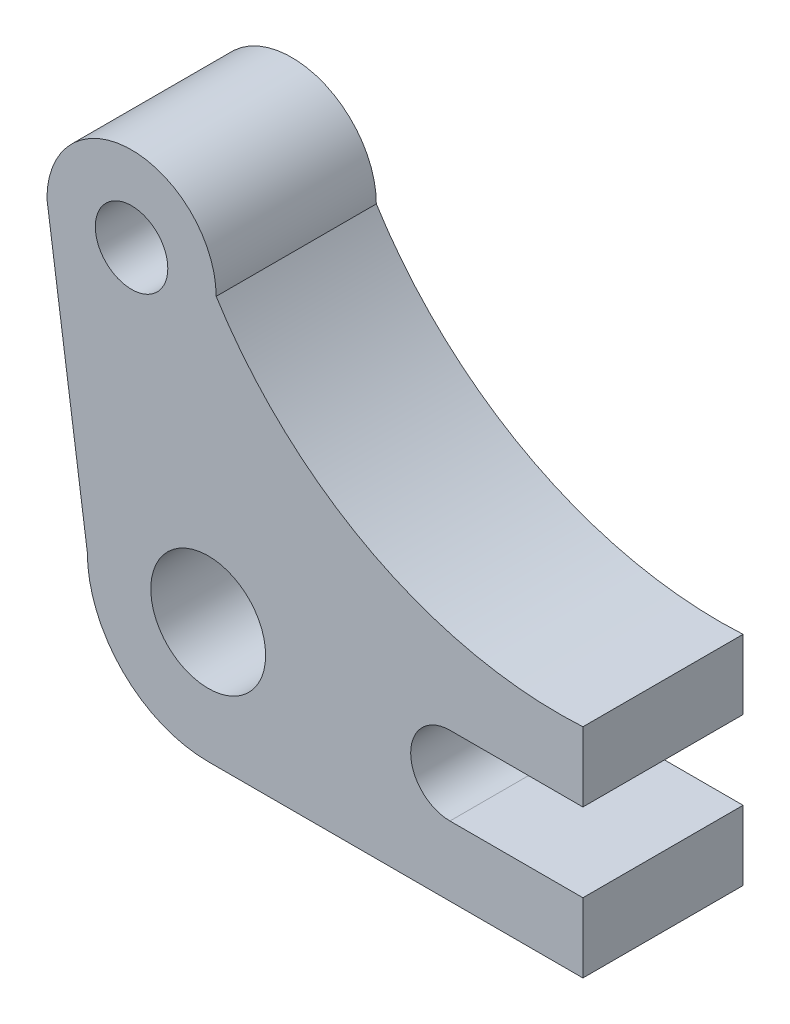
ISO-10303-21;
HEADER;
FILE_DESCRIPTION(('STEP AP214'),'2;1');
FILE_NAME('part.step','',(''),(''),'','','');
FILE_SCHEMA(('AUTOMOTIVE_DESIGN { 1 0 10303 214 1 1 1 1 }'));
ENDSEC;
DATA;
#1=APPLICATION_CONTEXT('core data for automotive mechanical design processes');
#2=APPLICATION_PROTOCOL_DEFINITION('international standard','automotive_design',2000,#1);
#3=PRODUCT_CONTEXT('',#1,'mechanical');
#4=PRODUCT('Part','Part','',(#3));
#5=PRODUCT_RELATED_PRODUCT_CATEGORY('part','',(#4));
#6=PRODUCT_DEFINITION_FORMATION('','',#4);
#7=PRODUCT_DEFINITION_CONTEXT('part definition',#1,'design');
#8=PRODUCT_DEFINITION('design','',#6,#7);
#9=PRODUCT_DEFINITION_SHAPE('','',#8);
#10=(LENGTH_UNIT() NAMED_UNIT(*) SI_UNIT(.MILLI.,.METRE.));
#11=(NAMED_UNIT(*) PLANE_ANGLE_UNIT() SI_UNIT($,.RADIAN.));
#12=(NAMED_UNIT(*) SI_UNIT($,.STERADIAN.) SOLID_ANGLE_UNIT());
#13=UNCERTAINTY_MEASURE_WITH_UNIT(LENGTH_MEASURE(1.E-05),#10,'distance_accuracy_value','');
#14=(GEOMETRIC_REPRESENTATION_CONTEXT(3) GLOBAL_UNCERTAINTY_ASSIGNED_CONTEXT((#13)) GLOBAL_UNIT_ASSIGNED_CONTEXT((#10,
#11,#12)) REPRESENTATION_CONTEXT('',''));
#15=CARTESIAN_POINT('',(0.,0.,0.));
#16=DIRECTION('',(0.,0.,1.));
#17=DIRECTION('',(1.,0.,0.));
#18=AXIS2_PLACEMENT_3D('',#15,#16,#17);
#19=CARTESIAN_POINT('',(58.1047405715076,82.8866724690707,26.5));
#20=DIRECTION('',(0.,0.,-1.));
#21=DIRECTION('',(-1.,0.,0.));
#22=AXIS2_PLACEMENT_3D('',#19,#20,#21);
#23=CYLINDRICAL_SURFACE('',#22,67.);
#24=CARTESIAN_POINT('',(58.1047405715076,82.8866724690707,0.));
#25=DIRECTION('',(0.,0.,1.));
#26=DIRECTION('',(1.,0.,0.));
#27=AXIS2_PLACEMENT_3D('',#24,#25,#26);
#28=CIRCLE('',#27,67.);
#29=CARTESIAN_POINT('',(1.31786678997644,47.3303654881644,0.));
#30=VERTEX_POINT('',#29);
#31=CARTESIAN_POINT('',(62.,16.,0.));
#32=VERTEX_POINT('',#31);
#33=EDGE_CURVE('E158',#30,#32,#28,.T.);
#34=ORIENTED_EDGE('',*,*,#33,.F.);
#35=DIRECTION('',(0.,0.,-1.));
#36=VECTOR('',#35,1.);
#37=CARTESIAN_POINT('',(1.31786678997644,47.3303654881644,26.5));
#38=LINE('',#37,#36);
#39=CARTESIAN_POINT('',(1.31786678997644,47.3303654881644,26.5));
#40=VERTEX_POINT('',#39);
#41=EDGE_CURVE('E11',#40,#30,#38,.T.);
#42=ORIENTED_EDGE('',*,*,#41,.F.);
#43=CARTESIAN_POINT('',(58.1047405715076,82.8866724690707,26.5));
#44=DIRECTION('',(0.,0.,1.));
#45=DIRECTION('',(1.,0.,0.));
#46=AXIS2_PLACEMENT_3D('',#43,#44,#45);
#47=CIRCLE('',#46,67.);
#48=CARTESIAN_POINT('',(62.,16.,26.5));
#49=VERTEX_POINT('',#48);
#50=EDGE_CURVE('E185',#40,#49,#47,.T.);
#51=ORIENTED_EDGE('',*,*,#50,.T.);
#52=DIRECTION('',(0.,0.,-1.));
#53=VECTOR('',#52,1.);
#54=CARTESIAN_POINT('',(62.,16.,26.5));
#55=LINE('',#54,#53);
#56=EDGE_CURVE('E101',#49,#32,#55,.T.);
#57=ORIENTED_EDGE('',*,*,#56,.T.);
#58=EDGE_LOOP('',(#34,#42,#51,#57));
#59=FACE_BOUND('',#58,.T.);
#60=ADVANCED_FACE('F45',(#59),#23,.F.);
#61=CARTESIAN_POINT('',(-12.6821332100236,47.3303654881643,26.5));
#62=DIRECTION('',(0.,0.,-1.));
#63=DIRECTION('',(-1.,0.,0.));
#64=AXIS2_PLACEMENT_3D('',#61,#62,#63);
#65=CYLINDRICAL_SURFACE('',#64,14.);
#66=CARTESIAN_POINT('',(-12.6821332100236,47.3303654881643,0.));
#67=DIRECTION('',(0.,0.,1.));
#68=DIRECTION('',(1.,0.,0.));
#69=AXIS2_PLACEMENT_3D('',#66,#67,#68);
#70=CIRCLE('',#69,14.);
#71=CARTESIAN_POINT('',(-26.6821332100236,47.3303654881643,0.));
#72=VERTEX_POINT('',#71);
#73=EDGE_CURVE('E161',#30,#72,#70,.T.);
#74=ORIENTED_EDGE('',*,*,#73,.T.);
#75=DIRECTION('',(0.,0.,-1.));
#76=VECTOR('',#75,1.);
#77=CARTESIAN_POINT('',(-26.6821332100236,47.3303654881643,26.5));
#78=LINE('',#77,#76);
#79=CARTESIAN_POINT('',(-26.6821332100236,47.3303654881643,26.5));
#80=VERTEX_POINT('',#79);
#81=EDGE_CURVE('E53',#80,#72,#78,.T.);
#82=ORIENTED_EDGE('',*,*,#81,.F.);
#83=CARTESIAN_POINT('',(-12.6821332100236,47.3303654881643,26.5));
#84=DIRECTION('',(0.,0.,1.));
#85=DIRECTION('',(1.,0.,0.));
#86=AXIS2_PLACEMENT_3D('',#83,#84,#85);
#87=CIRCLE('',#86,14.);
#88=EDGE_CURVE('E230',#40,#80,#87,.T.);
#89=ORIENTED_EDGE('',*,*,#88,.F.);
#90=ORIENTED_EDGE('',*,*,#41,.T.);
#91=EDGE_LOOP('',(#74,#82,#89,#90));
#92=FACE_BOUND('',#91,.T.);
#93=ADVANCED_FACE('F232',(#92),#65,.T.);
#94=CARTESIAN_POINT('',(-19.6091507108185,-2.76843324224664,26.5));
#95=DIRECTION('',(0.990180557040445,0.13979436490458,0.));
#96=DIRECTION('',(-0.13979436490458,0.990180557040445,0.));
#97=AXIS2_PLACEMENT_3D('',#94,#95,#96);
#98=PLANE('',#97);
#99=DIRECTION('',(0.13979436490458,-0.990180557040445,0.));
#100=VECTOR('',#99,1.);
#101=CARTESIAN_POINT('',(-19.6091507108185,-2.76843324224664,0.));
#102=LINE('',#101,#100);
#103=CARTESIAN_POINT('',(-20.,0.,0.));
#104=VERTEX_POINT('',#103);
#105=EDGE_CURVE('E163',#72,#104,#102,.T.);
#106=ORIENTED_EDGE('',*,*,#105,.T.);
#107=DIRECTION('',(0.,0.,-1.));
#108=VECTOR('',#107,1.);
#109=CARTESIAN_POINT('',(-20.,0.,26.5));
#110=LINE('',#109,#108);
#111=CARTESIAN_POINT('',(-20.,0.,26.5));
#112=VERTEX_POINT('',#111);
#113=EDGE_CURVE('E197',#112,#104,#110,.T.);
#114=ORIENTED_EDGE('',*,*,#113,.F.);
#115=DIRECTION('',(0.13979436490458,-0.990180557040445,0.));
#116=VECTOR('',#115,1.);
#117=CARTESIAN_POINT('',(-19.6091507108185,-2.76843324224664,26.5));
#118=LINE('',#117,#116);
#119=EDGE_CURVE('E206',#80,#112,#118,.T.);
#120=ORIENTED_EDGE('',*,*,#119,.F.);
#121=ORIENTED_EDGE('',*,*,#81,.T.);
#122=EDGE_LOOP('',(#106,#114,#120,#121));
#123=FACE_BOUND('',#122,.T.);
#124=ADVANCED_FACE('F204',(#123),#98,.F.);
#125=CARTESIAN_POINT('',(0.,0.,26.5));
#126=DIRECTION('',(0.,0.,-1.));
#127=DIRECTION('',(-1.,0.,0.));
#128=AXIS2_PLACEMENT_3D('',#125,#126,#127);
#129=CYLINDRICAL_SURFACE('',#128,20.);
#130=CARTESIAN_POINT('',(0.,0.,0.));
#131=DIRECTION('',(0.,0.,1.));
#132=DIRECTION('',(1.,0.,0.));
#133=AXIS2_PLACEMENT_3D('',#130,#131,#132);
#134=CIRCLE('',#133,20.);
#135=CARTESIAN_POINT('',(0.,-20.,0.));
#136=VERTEX_POINT('',#135);
#137=EDGE_CURVE('E165',#104,#136,#134,.T.);
#138=ORIENTED_EDGE('',*,*,#137,.T.);
#139=DIRECTION('',(0.,0.,-1.));
#140=VECTOR('',#139,1.);
#141=CARTESIAN_POINT('',(0.,-20.,26.5));
#142=LINE('',#141,#140);
#143=CARTESIAN_POINT('',(0.,-20.,26.5));
#144=VERTEX_POINT('',#143);
#145=EDGE_CURVE('E194',#144,#136,#142,.T.);
#146=ORIENTED_EDGE('',*,*,#145,.F.);
#147=CARTESIAN_POINT('',(0.,0.,26.5));
#148=DIRECTION('',(0.,0.,1.));
#149=DIRECTION('',(1.,0.,0.));
#150=AXIS2_PLACEMENT_3D('',#147,#148,#149);
#151=CIRCLE('',#150,20.);
#152=EDGE_CURVE('E225',#112,#144,#151,.T.);
#153=ORIENTED_EDGE('',*,*,#152,.F.);
#154=ORIENTED_EDGE('',*,*,#113,.T.);
#155=EDGE_LOOP('',(#138,#146,#153,#154));
#156=FACE_BOUND('',#155,.T.);
#157=ADVANCED_FACE('F217',(#156),#129,.T.);
#158=CARTESIAN_POINT('',(0.,-20.,26.5));
#159=DIRECTION('',(0.,1.,0.));
#160=DIRECTION('',(0.,0.,1.));
#161=AXIS2_PLACEMENT_3D('',#158,#159,#160);
#162=PLANE('',#161);
#163=DIRECTION('',(1.,0.,0.));
#164=VECTOR('',#163,1.);
#165=CARTESIAN_POINT('',(0.,-20.,0.));
#166=LINE('',#165,#164);
#167=CARTESIAN_POINT('',(62.,-20.,0.));
#168=VERTEX_POINT('',#167);
#169=EDGE_CURVE('E167',#136,#168,#166,.T.);
#170=ORIENTED_EDGE('',*,*,#169,.T.);
#171=DIRECTION('',(0.,0.,-1.));
#172=VECTOR('',#171,1.);
#173=CARTESIAN_POINT('',(62.,-20.,26.5));
#174=LINE('',#173,#172);
#175=CARTESIAN_POINT('',(62.,-20.,26.5));
#176=VERTEX_POINT('',#175);
#177=EDGE_CURVE('E191',#176,#168,#174,.T.);
#178=ORIENTED_EDGE('',*,*,#177,.F.);
#179=DIRECTION('',(1.,0.,0.));
#180=VECTOR('',#179,1.);
#181=CARTESIAN_POINT('',(0.,-20.,26.5));
#182=LINE('',#181,#180);
#183=EDGE_CURVE('E223',#144,#176,#182,.T.);
#184=ORIENTED_EDGE('',*,*,#183,.F.);
#185=ORIENTED_EDGE('',*,*,#145,.T.);
#186=EDGE_LOOP('',(#170,#178,#184,#185));
#187=FACE_BOUND('',#186,.T.);
#188=ADVANCED_FACE('F221',(#187),#162,.F.);
#189=CARTESIAN_POINT('',(62.,0.,26.5));
#190=DIRECTION('',(-1.,0.,0.));
#191=DIRECTION('',(0.,0.,1.));
#192=AXIS2_PLACEMENT_3D('',#189,#190,#191);
#193=PLANE('',#192);
#194=DIRECTION('',(0.,1.,0.));
#195=VECTOR('',#194,1.);
#196=CARTESIAN_POINT('',(62.,0.,0.));
#197=LINE('',#196,#195);
#198=CARTESIAN_POINT('',(62.,-8.5,0.));
#199=VERTEX_POINT('',#198);
#200=EDGE_CURVE('E169',#168,#199,#197,.T.);
#201=ORIENTED_EDGE('',*,*,#200,.T.);
#202=DIRECTION('',(0.,0.,-1.));
#203=VECTOR('',#202,1.);
#204=CARTESIAN_POINT('',(62.,-8.5,26.5));
#205=LINE('',#204,#203);
#206=CARTESIAN_POINT('',(62.,-8.5,26.5));
#207=VERTEX_POINT('',#206);
#208=EDGE_CURVE('E189',#207,#199,#205,.T.);
#209=ORIENTED_EDGE('',*,*,#208,.F.);
#210=DIRECTION('',(0.,1.,0.));
#211=VECTOR('',#210,1.);
#212=CARTESIAN_POINT('',(62.,0.,26.5));
#213=LINE('',#212,#211);
#214=EDGE_CURVE('E147',#176,#207,#213,.T.);
#215=ORIENTED_EDGE('',*,*,#214,.F.);
#216=ORIENTED_EDGE('',*,*,#177,.T.);
#217=EDGE_LOOP('',(#201,#209,#215,#216));
#218=FACE_BOUND('',#217,.T.);
#219=ADVANCED_FACE('F244',(#218),#193,.F.);
#220=CARTESIAN_POINT('',(0.,-8.5,26.5));
#221=DIRECTION('',(0.,1.,0.));
#222=DIRECTION('',(0.,0.,1.));
#223=AXIS2_PLACEMENT_3D('',#220,#221,#222);
#224=PLANE('',#223);
#225=DIRECTION('',(1.,0.,0.));
#226=VECTOR('',#225,1.);
#227=CARTESIAN_POINT('',(0.,-8.5,0.));
#228=LINE('',#227,#226);
#229=CARTESIAN_POINT('',(40.,-8.5,0.));
#230=VERTEX_POINT('',#229);
#231=EDGE_CURVE('E172',#230,#199,#228,.T.);
#232=ORIENTED_EDGE('',*,*,#231,.F.);
#233=DIRECTION('',(0.,0.,-1.));
#234=VECTOR('',#233,1.);
#235=CARTESIAN_POINT('',(40.,-8.5,26.5));
#236=LINE('',#235,#234);
#237=CARTESIAN_POINT('',(40.,-8.5,26.5));
#238=VERTEX_POINT('',#237);
#239=EDGE_CURVE('E135',#238,#230,#236,.T.);
#240=ORIENTED_EDGE('',*,*,#239,.F.);
#241=DIRECTION('',(1.,0.,0.));
#242=VECTOR('',#241,1.);
#243=CARTESIAN_POINT('',(0.,-8.5,26.5));
#244=LINE('',#243,#242);
#245=EDGE_CURVE('E145',#238,#207,#244,.T.);
#246=ORIENTED_EDGE('',*,*,#245,.T.);
#247=ORIENTED_EDGE('',*,*,#208,.T.);
#248=EDGE_LOOP('',(#232,#240,#246,#247));
#249=FACE_BOUND('',#248,.T.);
#250=ADVANCED_FACE('F247',(#249),#224,.T.);
#251=CARTESIAN_POINT('',(40.,-2.,26.5));
#252=DIRECTION('',(0.,0.,-1.));
#253=DIRECTION('',(-1.,0.,0.));
#254=AXIS2_PLACEMENT_3D('',#251,#252,#253);
#255=CYLINDRICAL_SURFACE('',#254,6.5);
#256=CARTESIAN_POINT('',(40.,-2.,0.));
#257=DIRECTION('',(0.,0.,1.));
#258=DIRECTION('',(1.,0.,0.));
#259=AXIS2_PLACEMENT_3D('',#256,#257,#258);
#260=CIRCLE('',#259,6.5);
#261=CARTESIAN_POINT('',(40.,4.5,0.));
#262=VERTEX_POINT('',#261);
#263=EDGE_CURVE('E134',#262,#230,#260,.T.);
#264=ORIENTED_EDGE('',*,*,#263,.F.);
#265=DIRECTION('',(0.,0.,-1.));
#266=VECTOR('',#265,1.);
#267=CARTESIAN_POINT('',(40.,4.5,26.5));
#268=LINE('',#267,#266);
#269=CARTESIAN_POINT('',(40.,4.5,26.5));
#270=VERTEX_POINT('',#269);
#271=EDGE_CURVE('E128',#270,#262,#268,.T.);
#272=ORIENTED_EDGE('',*,*,#271,.F.);
#273=CARTESIAN_POINT('',(40.,-2.,26.5));
#274=DIRECTION('',(0.,0.,1.));
#275=DIRECTION('',(1.,0.,0.));
#276=AXIS2_PLACEMENT_3D('',#273,#274,#275);
#277=CIRCLE('',#276,6.5);
#278=EDGE_CURVE('E132',#270,#238,#277,.T.);
#279=ORIENTED_EDGE('',*,*,#278,.T.);
#280=ORIENTED_EDGE('',*,*,#239,.T.);
#281=EDGE_LOOP('',(#264,#272,#279,#280));
#282=FACE_BOUND('',#281,.T.);
#283=ADVANCED_FACE('F130',(#282),#255,.F.);
#284=CARTESIAN_POINT('',(0.,4.5,26.5));
#285=DIRECTION('',(0.,1.,0.));
#286=DIRECTION('',(0.,0.,1.));
#287=AXIS2_PLACEMENT_3D('',#284,#285,#286);
#288=PLANE('',#287);
#289=DIRECTION('',(1.,0.,0.));
#290=VECTOR('',#289,1.);
#291=CARTESIAN_POINT('',(0.,4.5,0.));
#292=LINE('',#291,#290);
#293=CARTESIAN_POINT('',(62.,4.5,0.));
#294=VERTEX_POINT('',#293);
#295=EDGE_CURVE('E94',#262,#294,#292,.T.);
#296=ORIENTED_EDGE('',*,*,#295,.T.);
#297=DIRECTION('',(0.,0.,-1.));
#298=VECTOR('',#297,1.);
#299=CARTESIAN_POINT('',(62.,4.5,26.5));
#300=LINE('',#299,#298);
#301=CARTESIAN_POINT('',(62.,4.5,26.5));
#302=VERTEX_POINT('',#301);
#303=EDGE_CURVE('E136',#302,#294,#300,.T.);
#304=ORIENTED_EDGE('',*,*,#303,.F.);
#305=DIRECTION('',(1.,0.,0.));
#306=VECTOR('',#305,1.);
#307=CARTESIAN_POINT('',(0.,4.5,26.5));
#308=LINE('',#307,#306);
#309=EDGE_CURVE('E138',#270,#302,#308,.T.);
#310=ORIENTED_EDGE('',*,*,#309,.F.);
#311=ORIENTED_EDGE('',*,*,#271,.T.);
#312=EDGE_LOOP('',(#296,#304,#310,#311));
#313=FACE_BOUND('',#312,.T.);
#314=ADVANCED_FACE('F139',(#313),#288,.F.);
#315=CARTESIAN_POINT('',(0.,0.,26.5));
#316=DIRECTION('',(0.,0.,-1.));
#317=DIRECTION('',(-1.,0.,0.));
#318=AXIS2_PLACEMENT_3D('',#315,#316,#317);
#319=CYLINDRICAL_SURFACE('',#318,9.5);
#320=CARTESIAN_POINT('',(0.,0.,26.5));
#321=DIRECTION('',(0.,0.,1.));
#322=DIRECTION('',(1.,0.,0.));
#323=AXIS2_PLACEMENT_3D('',#320,#321,#322);
#324=CIRCLE('',#323,9.5);
#325=CARTESIAN_POINT('',(9.5,0.,26.5));
#326=VERTEX_POINT('',#325);
#327=EDGE_CURVE('E152',#326,#326,#324,.T.);
#328=ORIENTED_EDGE('',*,*,#327,.T.);
#329=EDGE_LOOP('',(#328));
#330=FACE_BOUND('',#329,.T.);
#331=CARTESIAN_POINT('',(0.,0.,0.));
#332=DIRECTION('',(0.,0.,1.));
#333=DIRECTION('',(1.,0.,0.));
#334=AXIS2_PLACEMENT_3D('',#331,#332,#333);
#335=CIRCLE('',#334,9.5);
#336=CARTESIAN_POINT('',(9.5,0.,0.));
#337=VERTEX_POINT('',#336);
#338=EDGE_CURVE('E179',#337,#337,#335,.T.);
#339=ORIENTED_EDGE('',*,*,#338,.F.);
#340=EDGE_LOOP('',(#339));
#341=FACE_BOUND('',#340,.T.);
#342=ADVANCED_FACE('F256',(#330,#341),#319,.F.);
#343=CARTESIAN_POINT('',(62.,0.,26.5));
#344=DIRECTION('',(-1.,0.,0.));
#345=DIRECTION('',(0.,-1.,0.));
#346=AXIS2_PLACEMENT_3D('',#343,#344,#345);
#347=PLANE('',#346);
#348=DIRECTION('',(0.,1.,0.));
#349=VECTOR('',#348,1.);
#350=CARTESIAN_POINT('',(62.,0.,0.));
#351=LINE('',#350,#349);
#352=EDGE_CURVE('E177',#294,#32,#351,.T.);
#353=ORIENTED_EDGE('',*,*,#352,.T.);
#354=ORIENTED_EDGE('',*,*,#56,.F.);
#355=DIRECTION('',(0.,1.,0.));
#356=VECTOR('',#355,1.);
#357=CARTESIAN_POINT('',(62.,0.,26.5));
#358=LINE('',#357,#356);
#359=EDGE_CURVE('E61',#302,#49,#358,.T.);
#360=ORIENTED_EDGE('',*,*,#359,.F.);
#361=ORIENTED_EDGE('',*,*,#303,.T.);
#362=EDGE_LOOP('',(#353,#354,#360,#361));
#363=FACE_BOUND('',#362,.T.);
#364=ADVANCED_FACE('F257',(#363),#347,.F.);
#365=CARTESIAN_POINT('',(-12.6821332100236,47.3303654881643,26.5));
#366=DIRECTION('',(0.,0.,-1.));
#367=DIRECTION('',(-1.,0.,0.));
#368=AXIS2_PLACEMENT_3D('',#365,#366,#367);
#369=CYLINDRICAL_SURFACE('',#368,6.);
#370=CARTESIAN_POINT('',(-12.6821332100236,47.3303654881643,26.5));
#371=DIRECTION('',(0.,0.,1.));
#372=DIRECTION('',(1.,0.,0.));
#373=AXIS2_PLACEMENT_3D('',#370,#371,#372);
#374=CIRCLE('',#373,6.);
#375=CARTESIAN_POINT('',(-6.68213321002356,47.3303654881643,26.5));
#376=VERTEX_POINT('',#375);
#377=EDGE_CURVE('E155',#376,#376,#374,.T.);
#378=ORIENTED_EDGE('',*,*,#377,.T.);
#379=EDGE_LOOP('',(#378));
#380=FACE_BOUND('',#379,.T.);
#381=CARTESIAN_POINT('',(-12.6821332100236,47.3303654881643,0.));
#382=DIRECTION('',(0.,0.,1.));
#383=DIRECTION('',(1.,0.,0.));
#384=AXIS2_PLACEMENT_3D('',#381,#382,#383);
#385=CIRCLE('',#384,6.);
#386=CARTESIAN_POINT('',(-6.68213321002356,47.3303654881643,0.));
#387=VERTEX_POINT('',#386);
#388=EDGE_CURVE('E182',#387,#387,#385,.T.);
#389=ORIENTED_EDGE('',*,*,#388,.F.);
#390=EDGE_LOOP('',(#389));
#391=FACE_BOUND('',#390,.T.);
#392=ADVANCED_FACE('F260',(#380,#391),#369,.F.);
#393=CARTESIAN_POINT('',(0.,0.,26.5));
#394=DIRECTION('',(0.,0.,1.));
#395=DIRECTION('',(1.,0.,0.));
#396=AXIS2_PLACEMENT_3D('',#393,#394,#395);
#397=PLANE('',#396);
#398=ORIENTED_EDGE('',*,*,#50,.F.);
#399=ORIENTED_EDGE('',*,*,#88,.T.);
#400=ORIENTED_EDGE('',*,*,#119,.T.);
#401=ORIENTED_EDGE('',*,*,#152,.T.);
#402=ORIENTED_EDGE('',*,*,#183,.T.);
#403=ORIENTED_EDGE('',*,*,#214,.T.);
#404=ORIENTED_EDGE('',*,*,#245,.F.);
#405=ORIENTED_EDGE('',*,*,#278,.F.);
#406=ORIENTED_EDGE('',*,*,#309,.T.);
#407=ORIENTED_EDGE('',*,*,#359,.T.);
#408=EDGE_LOOP('',(#398,#399,#400,#401,#402,#403,#404,#405,#406,#407));
#409=FACE_BOUND('',#408,.T.);
#410=ORIENTED_EDGE('',*,*,#327,.F.);
#411=EDGE_LOOP('',(#410));
#412=FACE_BOUND('',#411,.T.);
#413=ORIENTED_EDGE('',*,*,#377,.F.);
#414=EDGE_LOOP('',(#413));
#415=FACE_BOUND('',#414,.T.);
#416=ADVANCED_FACE('F142',(#409,#412,#415),#397,.T.);
#417=CARTESIAN_POINT('',(0.,0.,0.));
#418=DIRECTION('',(0.,0.,1.));
#419=DIRECTION('',(1.,0.,0.));
#420=AXIS2_PLACEMENT_3D('',#417,#418,#419);
#421=PLANE('',#420);
#422=ORIENTED_EDGE('',*,*,#33,.T.);
#423=ORIENTED_EDGE('',*,*,#352,.F.);
#424=ORIENTED_EDGE('',*,*,#295,.F.);
#425=ORIENTED_EDGE('',*,*,#263,.T.);
#426=ORIENTED_EDGE('',*,*,#231,.T.);
#427=ORIENTED_EDGE('',*,*,#200,.F.);
#428=ORIENTED_EDGE('',*,*,#169,.F.);
#429=ORIENTED_EDGE('',*,*,#137,.F.);
#430=ORIENTED_EDGE('',*,*,#105,.F.);
#431=ORIENTED_EDGE('',*,*,#73,.F.);
#432=EDGE_LOOP('',(#422,#423,#424,#425,#426,#427,#428,#429,#430,#431));
#433=FACE_BOUND('',#432,.T.);
#434=ORIENTED_EDGE('',*,*,#338,.T.);
#435=EDGE_LOOP('',(#434));
#436=FACE_BOUND('',#435,.T.);
#437=ORIENTED_EDGE('',*,*,#388,.T.);
#438=EDGE_LOOP('',(#437));
#439=FACE_BOUND('',#438,.T.);
#440=ADVANCED_FACE('F211',(#433,#436,#439),#421,.F.);
#441=CLOSED_SHELL('',(#60,#93,#124,#157,#188,#219,#250,#283,#314,#342,#364,#392,#416,#440));
#442=MANIFOLD_SOLID_BREP('B2',#441);
#443=ADVANCED_BREP_SHAPE_REPRESENTATION('',(#18,#442),#14);
#444=SHAPE_DEFINITION_REPRESENTATION(#9,#443);
ENDSEC;
END-ISO-10303-21;
